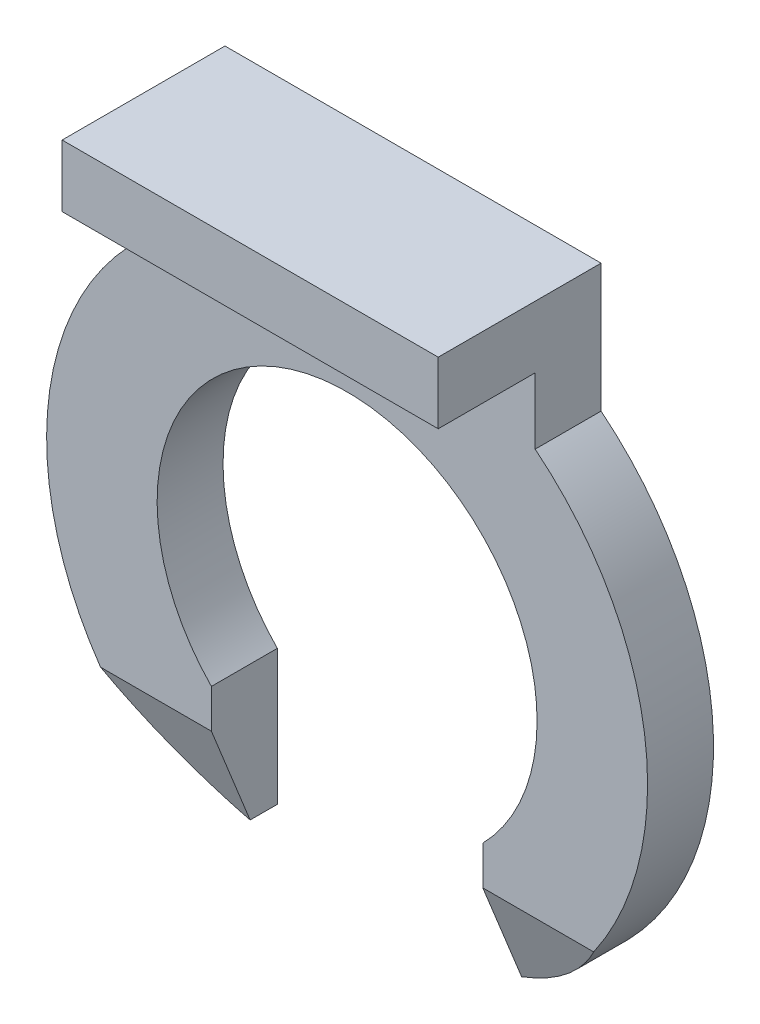
ISO-10303-21;
HEADER;
FILE_DESCRIPTION(('STEP AP214'),'2;1');
FILE_NAME('part.step','',(''),(''),'','','');
FILE_SCHEMA(('AUTOMOTIVE_DESIGN { 1 0 10303 214 1 1 1 1 }'));
ENDSEC;
DATA;
#1=APPLICATION_CONTEXT('core data for automotive mechanical design processes');
#2=APPLICATION_PROTOCOL_DEFINITION('international standard','automotive_design',2000,#1);
#3=PRODUCT_CONTEXT('',#1,'mechanical');
#4=PRODUCT('Part','Part','',(#3));
#5=PRODUCT_RELATED_PRODUCT_CATEGORY('part','',(#4));
#6=PRODUCT_DEFINITION_FORMATION('','',#4);
#7=PRODUCT_DEFINITION_CONTEXT('part definition',#1,'design');
#8=PRODUCT_DEFINITION('design','',#6,#7);
#9=PRODUCT_DEFINITION_SHAPE('','',#8);
#10=(LENGTH_UNIT() NAMED_UNIT(*) SI_UNIT(.MILLI.,.METRE.));
#11=(NAMED_UNIT(*) PLANE_ANGLE_UNIT() SI_UNIT($,.RADIAN.));
#12=(NAMED_UNIT(*) SI_UNIT($,.STERADIAN.) SOLID_ANGLE_UNIT());
#13=UNCERTAINTY_MEASURE_WITH_UNIT(LENGTH_MEASURE(1.E-05),#10,'distance_accuracy_value','');
#14=(GEOMETRIC_REPRESENTATION_CONTEXT(3) GLOBAL_UNCERTAINTY_ASSIGNED_CONTEXT((#13)) GLOBAL_UNIT_ASSIGNED_CONTEXT((#10,
#11,#12)) REPRESENTATION_CONTEXT('',''));
#15=CARTESIAN_POINT('',(0.,0.,0.));
#16=DIRECTION('',(0.,0.,1.));
#17=DIRECTION('',(1.,0.,0.));
#18=AXIS2_PLACEMENT_3D('',#15,#16,#17);
#19=CARTESIAN_POINT('',(-2.425,3.875,0.));
#20=DIRECTION('',(0.,-1.,0.));
#21=DIRECTION('',(0.,0.,-1.));
#22=AXIS2_PLACEMENT_3D('',#19,#20,#21);
#23=PLANE('',#22);
#24=DIRECTION('',(1.,0.,0.));
#25=VECTOR('',#24,1.);
#26=CARTESIAN_POINT('',(0.,3.875,2.1));
#27=LINE('',#26,#25);
#28=CARTESIAN_POINT('',(-2.425,3.875,2.1));
#29=VERTEX_POINT('',#28);
#30=CARTESIAN_POINT('',(2.425,3.875,2.1));
#31=VERTEX_POINT('',#30);
#32=EDGE_CURVE('E103',#29,#31,#27,.T.);
#33=ORIENTED_EDGE('',*,*,#32,.F.);
#34=DIRECTION('',(0.,0.,1.));
#35=VECTOR('',#34,1.);
#36=CARTESIAN_POINT('',(-2.425,3.875,0.));
#37=LINE('',#36,#35);
#38=CARTESIAN_POINT('',(-2.425,3.875,0.85));
#39=VERTEX_POINT('',#38);
#40=EDGE_CURVE('E179',#39,#29,#37,.T.);
#41=ORIENTED_EDGE('',*,*,#40,.F.);
#42=DIRECTION('',(1.,0.,0.));
#43=VECTOR('',#42,1.);
#44=CARTESIAN_POINT('',(0.,3.875,0.85));
#45=LINE('',#44,#43);
#46=CARTESIAN_POINT('',(2.425,3.875,0.85));
#47=VERTEX_POINT('',#46);
#48=EDGE_CURVE('E184',#47,#39,#45,.F.);
#49=ORIENTED_EDGE('',*,*,#48,.F.);
#50=DIRECTION('',(0.,0.,-1.));
#51=VECTOR('',#50,1.);
#52=CARTESIAN_POINT('',(2.425,3.875,0.));
#53=LINE('',#52,#51);
#54=EDGE_CURVE('E136',#31,#47,#53,.T.);
#55=ORIENTED_EDGE('',*,*,#54,.F.);
#56=EDGE_LOOP('',(#33,#41,#49,#55));
#57=FACE_BOUND('',#56,.T.);
#58=ADVANCED_FACE('F17',(#57),#23,.T.);
#59=CARTESIAN_POINT('',(2.10744426613017,-2.83564281994822,0.6));
#60=DIRECTION('',(0.,-0.373450176653172,0.927650238806478));
#61=DIRECTION('',(0.,-0.927650238806478,-0.373450176653172));
#62=AXIS2_PLACEMENT_3D('',#59,#60,#61);
#63=PLANE('',#62);
#64=CARTESIAN_POINT('',(0.,0.,1.74156313202424));
#65=DIRECTION('',(0.,-0.373450176653172,0.927650238806478));
#66=DIRECTION('',(0.,0.927650238806478,0.373450176653172));
#67=AXIS2_PLACEMENT_3D('',#64,#65,#66);
#68=ELLIPSE('',#67,4.1772209372636,3.875);
#69=CARTESIAN_POINT('',(3.17977706452069,-2.21464281994822,0.85));
#70=VERTEX_POINT('',#69);
#71=CARTESIAN_POINT('',(1.75064272523284,-3.45684094068021,0.35));
#72=VERTEX_POINT('',#71);
#73=EDGE_CURVE('E215',#70,#72,#68,.F.);
#74=ORIENTED_EDGE('',*,*,#73,.F.);
#75=DIRECTION('',(1.,0.,0.));
#76=VECTOR('',#75,1.);
#77=CARTESIAN_POINT('',(0.,-2.21464281994822,0.85));
#78=LINE('',#77,#76);
#79=CARTESIAN_POINT('',(1.75,-2.21464281994822,0.85));
#80=VERTEX_POINT('',#79);
#81=EDGE_CURVE('E135',#80,#70,#78,.T.);
#82=ORIENTED_EDGE('',*,*,#81,.F.);
#83=DIRECTION('',(0.,-0.927650238806478,-0.373450176653172));
#84=VECTOR('',#83,1.);
#85=CARTESIAN_POINT('',(1.75,-2.83564281994822,0.6));
#86=LINE('',#85,#84);
#87=EDGE_CURVE('E86',#80,#72,#86,.T.);
#88=ORIENTED_EDGE('',*,*,#87,.T.);
#89=EDGE_LOOP('',(#74,#82,#88));
#90=FACE_BOUND('',#89,.T.);
#91=ADVANCED_FACE('F252',(#90),#63,.T.);
#92=CARTESIAN_POINT('',(-2.425,3.875,0.));
#93=DIRECTION('',(-1.,0.,0.));
#94=DIRECTION('',(0.,0.,1.));
#95=AXIS2_PLACEMENT_3D('',#92,#93,#94);
#96=PLANE('',#95);
#97=DIRECTION('',(0.,1.,0.));
#98=VECTOR('',#97,1.);
#99=CARTESIAN_POINT('',(-2.425,4.275,2.1));
#100=LINE('',#99,#98);
#101=CARTESIAN_POINT('',(-2.425,4.675,2.1));
#102=VERTEX_POINT('',#101);
#103=EDGE_CURVE('E181',#102,#29,#100,.F.);
#104=ORIENTED_EDGE('',*,*,#103,.F.);
#105=DIRECTION('',(0.,0.,1.));
#106=VECTOR('',#105,1.);
#107=CARTESIAN_POINT('',(-2.425,4.675,0.));
#108=LINE('',#107,#106);
#109=CARTESIAN_POINT('',(-2.425,4.675,0.));
#110=VERTEX_POINT('',#109);
#111=EDGE_CURVE('E115',#110,#102,#108,.T.);
#112=ORIENTED_EDGE('',*,*,#111,.F.);
#113=DIRECTION('',(0.,1.,0.));
#114=VECTOR('',#113,1.);
#115=CARTESIAN_POINT('',(-2.425,3.875,0.));
#116=LINE('',#115,#114);
#117=CARTESIAN_POINT('',(-2.425,3.02241625194148,0.));
#118=VERTEX_POINT('',#117);
#119=EDGE_CURVE('E168',#110,#118,#116,.F.);
#120=ORIENTED_EDGE('',*,*,#119,.T.);
#121=DIRECTION('',(0.,0.,1.));
#122=VECTOR('',#121,1.);
#123=CARTESIAN_POINT('',(-2.425,3.02241625194148,0.));
#124=LINE('',#123,#122);
#125=CARTESIAN_POINT('',(-2.425,3.02241625194148,0.85));
#126=VERTEX_POINT('',#125);
#127=EDGE_CURVE('E177',#118,#126,#124,.T.);
#128=ORIENTED_EDGE('',*,*,#127,.T.);
#129=DIRECTION('',(0.,1.,0.));
#130=VECTOR('',#129,1.);
#131=CARTESIAN_POINT('',(-2.425,0.208835414257584,0.85));
#132=LINE('',#131,#130);
#133=EDGE_CURVE('E148',#39,#126,#132,.F.);
#134=ORIENTED_EDGE('',*,*,#133,.F.);
#135=ORIENTED_EDGE('',*,*,#40,.T.);
#136=EDGE_LOOP('',(#104,#112,#120,#128,#134,#135));
#137=FACE_BOUND('',#136,.T.);
#138=ADVANCED_FACE('F254',(#137),#96,.T.);
#139=CARTESIAN_POINT('',(0.,4.275,2.1));
#140=DIRECTION('',(0.,0.,1.));
#141=DIRECTION('',(1.,0.,0.));
#142=AXIS2_PLACEMENT_3D('',#139,#140,#141);
#143=PLANE('',#142);
#144=DIRECTION('',(0.,1.,0.));
#145=VECTOR('',#144,1.);
#146=CARTESIAN_POINT('',(2.425,3.02241625194148,2.1));
#147=LINE('',#146,#145);
#148=CARTESIAN_POINT('',(2.425,4.675,2.1));
#149=VERTEX_POINT('',#148);
#150=EDGE_CURVE('E174',#149,#31,#147,.F.);
#151=ORIENTED_EDGE('',*,*,#150,.F.);
#152=DIRECTION('',(1.,0.,0.));
#153=VECTOR('',#152,1.);
#154=CARTESIAN_POINT('',(2.425,4.675,2.1));
#155=LINE('',#154,#153);
#156=EDGE_CURVE('E119',#102,#149,#155,.T.);
#157=ORIENTED_EDGE('',*,*,#156,.F.);
#158=ORIENTED_EDGE('',*,*,#103,.T.);
#159=ORIENTED_EDGE('',*,*,#32,.T.);
#160=EDGE_LOOP('',(#151,#157,#158,#159));
#161=FACE_BOUND('',#160,.T.);
#162=ADVANCED_FACE('F260',(#161),#143,.T.);
#163=CARTESIAN_POINT('',(2.425,3.02241625194148,0.));
#164=DIRECTION('',(1.,0.,0.));
#165=DIRECTION('',(0.,0.,-1.));
#166=AXIS2_PLACEMENT_3D('',#163,#164,#165);
#167=PLANE('',#166);
#168=DIRECTION('',(0.,1.,0.));
#169=VECTOR('',#168,1.);
#170=CARTESIAN_POINT('',(2.425,0.208835414257584,0.85));
#171=LINE('',#170,#169);
#172=CARTESIAN_POINT('',(2.425,3.02241625194148,0.85));
#173=VERTEX_POINT('',#172);
#174=EDGE_CURVE('E186',#173,#47,#171,.T.);
#175=ORIENTED_EDGE('',*,*,#174,.F.);
#176=DIRECTION('',(0.,0.,1.));
#177=VECTOR('',#176,1.);
#178=CARTESIAN_POINT('',(2.425,3.02241625194148,0.));
#179=LINE('',#178,#177);
#180=CARTESIAN_POINT('',(2.425,3.02241625194148,0.));
#181=VERTEX_POINT('',#180);
#182=EDGE_CURVE('E75',#181,#173,#179,.T.);
#183=ORIENTED_EDGE('',*,*,#182,.F.);
#184=DIRECTION('',(0.,1.,0.));
#185=VECTOR('',#184,1.);
#186=CARTESIAN_POINT('',(2.425,3.02241625194148,0.));
#187=LINE('',#186,#185);
#188=CARTESIAN_POINT('',(2.425,4.675,0.));
#189=VERTEX_POINT('',#188);
#190=EDGE_CURVE('E171',#181,#189,#187,.T.);
#191=ORIENTED_EDGE('',*,*,#190,.T.);
#192=DIRECTION('',(0.,0.,1.));
#193=VECTOR('',#192,1.);
#194=CARTESIAN_POINT('',(2.425,4.675,0.));
#195=LINE('',#194,#193);
#196=EDGE_CURVE('E199',#149,#189,#195,.F.);
#197=ORIENTED_EDGE('',*,*,#196,.F.);
#198=ORIENTED_EDGE('',*,*,#150,.T.);
#199=ORIENTED_EDGE('',*,*,#54,.T.);
#200=EDGE_LOOP('',(#175,#183,#191,#197,#198,#199));
#201=FACE_BOUND('',#200,.T.);
#202=ADVANCED_FACE('F295',(#201),#167,.T.);
#203=CARTESIAN_POINT('',(-2.82233279839051,-2.83564281994822,0.6));
#204=DIRECTION('',(0.,-0.373450176653171,0.927650238806478));
#205=DIRECTION('',(0.,-0.927650238806478,-0.373450176653171));
#206=AXIS2_PLACEMENT_3D('',#203,#204,#205);
#207=PLANE('',#206);
#208=DIRECTION('',(0.,-0.927650238806478,-0.373450176653171));
#209=VECTOR('',#208,1.);
#210=CARTESIAN_POINT('',(-1.75,-2.83564281994822,0.6));
#211=LINE('',#210,#209);
#212=CARTESIAN_POINT('',(-1.75064272523284,-3.45684094068021,0.35));
#213=VERTEX_POINT('',#212);
#214=CARTESIAN_POINT('',(-1.75,-2.21464281994822,0.85));
#215=VERTEX_POINT('',#214);
#216=EDGE_CURVE('E126',#213,#215,#211,.F.);
#217=ORIENTED_EDGE('',*,*,#216,.T.);
#218=DIRECTION('',(1.,0.,0.));
#219=VECTOR('',#218,1.);
#220=CARTESIAN_POINT('',(0.,-2.21464281994822,0.85));
#221=LINE('',#220,#219);
#222=CARTESIAN_POINT('',(-3.17977706452069,-2.21464281994822,0.85));
#223=VERTEX_POINT('',#222);
#224=EDGE_CURVE('E129',#223,#215,#221,.T.);
#225=ORIENTED_EDGE('',*,*,#224,.F.);
#226=CARTESIAN_POINT('',(0.,0.,1.74156313202424));
#227=DIRECTION('',(0.,-0.373450176653171,0.927650238806478));
#228=DIRECTION('',(0.,0.927650238806478,0.373450176653171));
#229=AXIS2_PLACEMENT_3D('',#226,#227,#228);
#230=ELLIPSE('',#229,4.1772209372636,3.875);
#231=EDGE_CURVE('E131',#213,#223,#230,.F.);
#232=ORIENTED_EDGE('',*,*,#231,.F.);
#233=EDGE_LOOP('',(#217,#225,#232));
#234=FACE_BOUND('',#233,.T.);
#235=ADVANCED_FACE('F128',(#234),#207,.T.);
#236=CARTESIAN_POINT('',(0.,0.208835414257584,0.85));
#237=DIRECTION('',(0.,0.,1.));
#238=DIRECTION('',(1.,0.,0.));
#239=AXIS2_PLACEMENT_3D('',#236,#237,#238);
#240=PLANE('',#239);
#241=CARTESIAN_POINT('',(0.,0.,0.85));
#242=DIRECTION('',(0.,0.,1.));
#243=DIRECTION('',(1.,0.,0.));
#244=AXIS2_PLACEMENT_3D('',#241,#242,#243);
#245=CIRCLE('',#244,2.45);
#246=CARTESIAN_POINT('',(-1.75,-1.71464281994822,0.85));
#247=VERTEX_POINT('',#246);
#248=CARTESIAN_POINT('',(1.75,-1.71464281994822,0.85));
#249=VERTEX_POINT('',#248);
#250=EDGE_CURVE('E156',#247,#249,#245,.F.);
#251=ORIENTED_EDGE('',*,*,#250,.T.);
#252=DIRECTION('',(0.,1.,0.));
#253=VECTOR('',#252,1.);
#254=CARTESIAN_POINT('',(1.75,0.208835414257584,0.85));
#255=LINE('',#254,#253);
#256=EDGE_CURVE('E147',#249,#80,#255,.F.);
#257=ORIENTED_EDGE('',*,*,#256,.T.);
#258=ORIENTED_EDGE('',*,*,#81,.T.);
#259=CARTESIAN_POINT('',(0.,0.,0.85));
#260=DIRECTION('',(0.,0.,1.));
#261=DIRECTION('',(1.,0.,0.));
#262=AXIS2_PLACEMENT_3D('',#259,#260,#261);
#263=CIRCLE('',#262,3.875);
#264=EDGE_CURVE('E20',#173,#70,#263,.F.);
#265=ORIENTED_EDGE('',*,*,#264,.F.);
#266=ORIENTED_EDGE('',*,*,#174,.T.);
#267=ORIENTED_EDGE('',*,*,#48,.T.);
#268=ORIENTED_EDGE('',*,*,#133,.T.);
#269=CARTESIAN_POINT('',(0.,0.,0.85));
#270=DIRECTION('',(0.,0.,1.));
#271=DIRECTION('',(1.,0.,0.));
#272=AXIS2_PLACEMENT_3D('',#269,#270,#271);
#273=CIRCLE('',#272,3.875);
#274=EDGE_CURVE('E146',#223,#126,#273,.F.);
#275=ORIENTED_EDGE('',*,*,#274,.F.);
#276=ORIENTED_EDGE('',*,*,#224,.T.);
#277=DIRECTION('',(0.,1.,0.));
#278=VECTOR('',#277,1.);
#279=CARTESIAN_POINT('',(-1.75,-3.45732917148483,0.85));
#280=LINE('',#279,#278);
#281=EDGE_CURVE('E142',#247,#215,#280,.F.);
#282=ORIENTED_EDGE('',*,*,#281,.F.);
#283=EDGE_LOOP('',(#251,#257,#258,#265,#266,#267,#268,#275,#276,#282));
#284=FACE_BOUND('',#283,.T.);
#285=ADVANCED_FACE('F141',(#284),#240,.T.);
#286=CARTESIAN_POINT('',(0.,0.,0.));
#287=DIRECTION('',(0.,0.,1.));
#288=DIRECTION('',(1.,0.,0.));
#289=AXIS2_PLACEMENT_3D('',#286,#287,#288);
#290=CYLINDRICAL_SURFACE('',#289,3.875);
#291=ORIENTED_EDGE('',*,*,#264,.T.);
#292=ORIENTED_EDGE('',*,*,#73,.T.);
#293=DIRECTION('',(0.,0.,1.));
#294=VECTOR('',#293,1.);
#295=CARTESIAN_POINT('',(1.75,-3.45732917148483,0.));
#296=LINE('',#295,#294);
#297=CARTESIAN_POINT('',(1.75,-3.45732917148483,0.));
#298=VERTEX_POINT('',#297);
#299=EDGE_CURVE('E227',#298,#72,#296,.T.);
#300=ORIENTED_EDGE('',*,*,#299,.F.);
#301=CARTESIAN_POINT('',(0.,0.,0.));
#302=DIRECTION('',(0.,0.,1.));
#303=DIRECTION('',(1.,0.,0.));
#304=AXIS2_PLACEMENT_3D('',#301,#302,#303);
#305=CIRCLE('',#304,3.875);
#306=EDGE_CURVE('E208',#298,#181,#305,.T.);
#307=ORIENTED_EDGE('',*,*,#306,.T.);
#308=ORIENTED_EDGE('',*,*,#182,.T.);
#309=EDGE_LOOP('',(#291,#292,#300,#307,#308));
#310=FACE_BOUND('',#309,.T.);
#311=ADVANCED_FACE('F288',(#310),#290,.T.);
#312=CARTESIAN_POINT('',(2.425,4.675,0.));
#313=DIRECTION('',(0.,1.,0.));
#314=DIRECTION('',(0.,0.,1.));
#315=AXIS2_PLACEMENT_3D('',#312,#313,#314);
#316=PLANE('',#315);
#317=ORIENTED_EDGE('',*,*,#156,.T.);
#318=ORIENTED_EDGE('',*,*,#196,.T.);
#319=DIRECTION('',(1.,0.,0.));
#320=VECTOR('',#319,1.);
#321=CARTESIAN_POINT('',(0.,4.675,0.));
#322=LINE('',#321,#320);
#323=EDGE_CURVE('E205',#189,#110,#322,.F.);
#324=ORIENTED_EDGE('',*,*,#323,.T.);
#325=ORIENTED_EDGE('',*,*,#111,.T.);
#326=EDGE_LOOP('',(#317,#318,#324,#325));
#327=FACE_BOUND('',#326,.T.);
#328=ADVANCED_FACE('F284',(#327),#316,.T.);
#329=CARTESIAN_POINT('',(0.,0.,0.));
#330=DIRECTION('',(0.,0.,1.));
#331=DIRECTION('',(1.,0.,0.));
#332=AXIS2_PLACEMENT_3D('',#329,#330,#331);
#333=CYLINDRICAL_SURFACE('',#332,3.875);
#334=ORIENTED_EDGE('',*,*,#231,.T.);
#335=ORIENTED_EDGE('',*,*,#274,.T.);
#336=ORIENTED_EDGE('',*,*,#127,.F.);
#337=CARTESIAN_POINT('',(0.,0.,0.));
#338=DIRECTION('',(0.,0.,1.));
#339=DIRECTION('',(1.,0.,0.));
#340=AXIS2_PLACEMENT_3D('',#337,#338,#339);
#341=CIRCLE('',#340,3.875);
#342=CARTESIAN_POINT('',(-1.75,-3.45732917148483,0.));
#343=VERTEX_POINT('',#342);
#344=EDGE_CURVE('E207',#118,#343,#341,.T.);
#345=ORIENTED_EDGE('',*,*,#344,.T.);
#346=DIRECTION('',(0.,0.,-1.));
#347=VECTOR('',#346,1.);
#348=CARTESIAN_POINT('',(-1.75,-3.45732917148483,0.));
#349=LINE('',#348,#347);
#350=EDGE_CURVE('E154',#213,#343,#349,.T.);
#351=ORIENTED_EDGE('',*,*,#350,.F.);
#352=EDGE_LOOP('',(#334,#335,#336,#345,#351));
#353=FACE_BOUND('',#352,.T.);
#354=ADVANCED_FACE('F281',(#353),#333,.T.);
#355=CARTESIAN_POINT('',(-1.75,-3.45732917148483,0.));
#356=DIRECTION('',(1.,0.,0.));
#357=DIRECTION('',(0.,0.,-1.));
#358=AXIS2_PLACEMENT_3D('',#355,#356,#357);
#359=PLANE('',#358);
#360=ORIENTED_EDGE('',*,*,#281,.T.);
#361=ORIENTED_EDGE('',*,*,#216,.F.);
#362=ORIENTED_EDGE('',*,*,#350,.T.);
#363=DIRECTION('',(0.,1.,0.));
#364=VECTOR('',#363,1.);
#365=CARTESIAN_POINT('',(-1.75,0.208835414257584,0.));
#366=LINE('',#365,#364);
#367=CARTESIAN_POINT('',(-1.75,-1.71464281994822,0.));
#368=VERTEX_POINT('',#367);
#369=EDGE_CURVE('E223',#343,#368,#366,.T.);
#370=ORIENTED_EDGE('',*,*,#369,.T.);
#371=DIRECTION('',(0.,0.,1.));
#372=VECTOR('',#371,1.);
#373=CARTESIAN_POINT('',(-1.75,-1.71464281994822,0.));
#374=LINE('',#373,#372);
#375=EDGE_CURVE('E153',#368,#247,#374,.T.);
#376=ORIENTED_EDGE('',*,*,#375,.T.);
#377=EDGE_LOOP('',(#360,#361,#362,#370,#376));
#378=FACE_BOUND('',#377,.T.);
#379=ADVANCED_FACE('F151',(#378),#359,.T.);
#380=CARTESIAN_POINT('',(0.,0.,0.));
#381=DIRECTION('',(0.,0.,1.));
#382=DIRECTION('',(1.,0.,0.));
#383=AXIS2_PLACEMENT_3D('',#380,#381,#382);
#384=CYLINDRICAL_SURFACE('',#383,2.45);
#385=DIRECTION('',(0.,0.,1.));
#386=VECTOR('',#385,1.);
#387=CARTESIAN_POINT('',(1.75,-1.71464281994822,0.));
#388=LINE('',#387,#386);
#389=CARTESIAN_POINT('',(1.75,-1.71464281994822,0.));
#390=VERTEX_POINT('',#389);
#391=EDGE_CURVE('E34',#249,#390,#388,.F.);
#392=ORIENTED_EDGE('',*,*,#391,.F.);
#393=ORIENTED_EDGE('',*,*,#250,.F.);
#394=ORIENTED_EDGE('',*,*,#375,.F.);
#395=CARTESIAN_POINT('',(0.,0.,0.));
#396=DIRECTION('',(0.,0.,1.));
#397=DIRECTION('',(1.,0.,0.));
#398=AXIS2_PLACEMENT_3D('',#395,#396,#397);
#399=CIRCLE('',#398,2.45);
#400=EDGE_CURVE('E26',#368,#390,#399,.F.);
#401=ORIENTED_EDGE('',*,*,#400,.T.);
#402=EDGE_LOOP('',(#392,#393,#394,#401));
#403=FACE_BOUND('',#402,.T.);
#404=ADVANCED_FACE('F272',(#403),#384,.F.);
#405=CARTESIAN_POINT('',(1.75,-1.71464281994822,0.));
#406=DIRECTION('',(-1.,0.,0.));
#407=DIRECTION('',(0.,0.,1.));
#408=AXIS2_PLACEMENT_3D('',#405,#406,#407);
#409=PLANE('',#408);
#410=DIRECTION('',(0.,1.,0.));
#411=VECTOR('',#410,1.);
#412=CARTESIAN_POINT('',(1.75,0.208835414257584,0.));
#413=LINE('',#412,#411);
#414=EDGE_CURVE('E11',#390,#298,#413,.F.);
#415=ORIENTED_EDGE('',*,*,#414,.T.);
#416=ORIENTED_EDGE('',*,*,#299,.T.);
#417=ORIENTED_EDGE('',*,*,#87,.F.);
#418=ORIENTED_EDGE('',*,*,#256,.F.);
#419=ORIENTED_EDGE('',*,*,#391,.T.);
#420=EDGE_LOOP('',(#415,#416,#417,#418,#419));
#421=FACE_BOUND('',#420,.T.);
#422=ADVANCED_FACE('F266',(#421),#409,.T.);
#423=CARTESIAN_POINT('',(0.,0.208835414257584,0.));
#424=DIRECTION('',(0.,0.,1.));
#425=DIRECTION('',(1.,0.,0.));
#426=AXIS2_PLACEMENT_3D('',#423,#424,#425);
#427=PLANE('',#426);
#428=ORIENTED_EDGE('',*,*,#400,.F.);
#429=ORIENTED_EDGE('',*,*,#369,.F.);
#430=ORIENTED_EDGE('',*,*,#344,.F.);
#431=ORIENTED_EDGE('',*,*,#119,.F.);
#432=ORIENTED_EDGE('',*,*,#323,.F.);
#433=ORIENTED_EDGE('',*,*,#190,.F.);
#434=ORIENTED_EDGE('',*,*,#306,.F.);
#435=ORIENTED_EDGE('',*,*,#414,.F.);
#436=EDGE_LOOP('',(#428,#429,#430,#431,#432,#433,#434,#435));
#437=FACE_BOUND('',#436,.T.);
#438=ADVANCED_FACE('F264',(#437),#427,.F.);
#439=CLOSED_SHELL('',(#58,#91,#138,#162,#202,#235,#285,#311,#328,#354,#379,#404,#422,#438));
#440=MANIFOLD_SOLID_BREP('B1',#439);
#441=ADVANCED_BREP_SHAPE_REPRESENTATION('',(#18,#440),#14);
#442=SHAPE_DEFINITION_REPRESENTATION(#9,#441);
ENDSEC;
END-ISO-10303-21;
